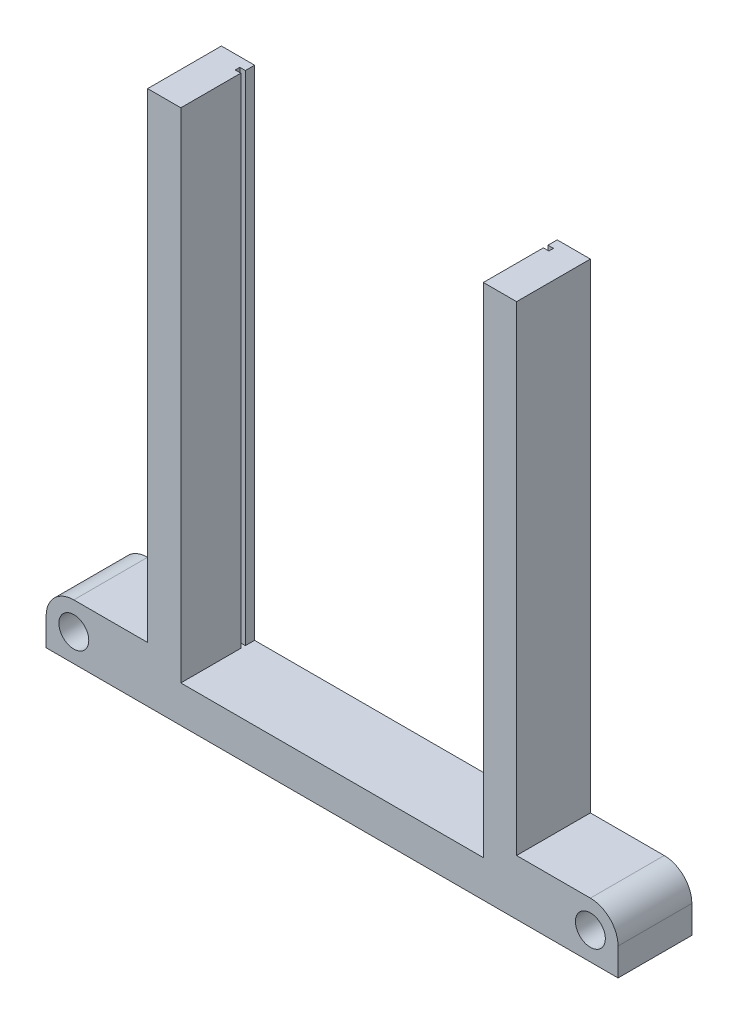
ISO-10303-21;
HEADER;
FILE_DESCRIPTION(('STEP AP214'),'2;1');
FILE_NAME('part.step','',(''),(''),'','','');
FILE_SCHEMA(('AUTOMOTIVE_DESIGN { 1 0 10303 214 1 1 1 1 }'));
ENDSEC;
DATA;
#1=APPLICATION_CONTEXT('core data for automotive mechanical design processes');
#2=APPLICATION_PROTOCOL_DEFINITION('international standard','automotive_design',2000,#1);
#3=PRODUCT_CONTEXT('',#1,'mechanical');
#4=PRODUCT('Part','Part','',(#3));
#5=PRODUCT_RELATED_PRODUCT_CATEGORY('part','',(#4));
#6=PRODUCT_DEFINITION_FORMATION('','',#4);
#7=PRODUCT_DEFINITION_CONTEXT('part definition',#1,'design');
#8=PRODUCT_DEFINITION('design','',#6,#7);
#9=PRODUCT_DEFINITION_SHAPE('','',#8);
#10=(LENGTH_UNIT() NAMED_UNIT(*) SI_UNIT(.MILLI.,.METRE.));
#11=(NAMED_UNIT(*) PLANE_ANGLE_UNIT() SI_UNIT($,.RADIAN.));
#12=(NAMED_UNIT(*) SI_UNIT($,.STERADIAN.) SOLID_ANGLE_UNIT());
#13=UNCERTAINTY_MEASURE_WITH_UNIT(LENGTH_MEASURE(1.E-05),#10,'distance_accuracy_value','');
#14=(GEOMETRIC_REPRESENTATION_CONTEXT(3) GLOBAL_UNCERTAINTY_ASSIGNED_CONTEXT((#13)) GLOBAL_UNIT_ASSIGNED_CONTEXT((#10,
#11,#12)) REPRESENTATION_CONTEXT('',''));
#15=CARTESIAN_POINT('',(0.,0.,0.));
#16=DIRECTION('',(0.,0.,1.));
#17=DIRECTION('',(1.,0.,0.));
#18=AXIS2_PLACEMENT_3D('',#15,#16,#17);
#19=CARTESIAN_POINT('',(-50.,145.,10.));
#20=DIRECTION('',(0.,-1.,0.));
#21=DIRECTION('',(0.,0.,-1.));
#22=AXIS2_PLACEMENT_3D('',#19,#20,#21);
#23=PLANE('',#22);
#24=DIRECTION('',(-1.,0.,0.));
#25=VECTOR('',#24,1.);
#26=CARTESIAN_POINT('',(-50.,145.,10.));
#27=LINE('',#26,#25);
#28=CARTESIAN_POINT('',(-41.,145.,10.));
#29=VERTEX_POINT('',#28);
#30=CARTESIAN_POINT('',(-50.,145.,10.));
#31=VERTEX_POINT('',#30);
#32=EDGE_CURVE('E144',#29,#31,#27,.T.);
#33=ORIENTED_EDGE('',*,*,#32,.F.);
#34=DIRECTION('',(0.,0.,1.));
#35=VECTOR('',#34,1.);
#36=CARTESIAN_POINT('',(-41.,145.,10.));
#37=LINE('',#36,#35);
#38=CARTESIAN_POINT('',(-41.,145.,-6.25));
#39=VERTEX_POINT('',#38);
#40=EDGE_CURVE('E311',#39,#29,#37,.T.);
#41=ORIENTED_EDGE('',*,*,#40,.F.);
#42=DIRECTION('',(1.,0.,0.));
#43=VECTOR('',#42,1.);
#44=CARTESIAN_POINT('',(-41.,145.,-6.25));
#45=LINE('',#44,#43);
#46=CARTESIAN_POINT('',(-42.5,145.,-6.25));
#47=VERTEX_POINT('',#46);
#48=EDGE_CURVE('E307',#47,#39,#45,.T.);
#49=ORIENTED_EDGE('',*,*,#48,.F.);
#50=DIRECTION('',(0.,0.,1.));
#51=VECTOR('',#50,1.);
#52=CARTESIAN_POINT('',(-42.5,145.,-6.25));
#53=LINE('',#52,#51);
#54=CARTESIAN_POINT('',(-42.5,145.,-7.5));
#55=VERTEX_POINT('',#54);
#56=EDGE_CURVE('E303',#55,#47,#53,.T.);
#57=ORIENTED_EDGE('',*,*,#56,.F.);
#58=DIRECTION('',(-1.,0.,0.));
#59=VECTOR('',#58,1.);
#60=CARTESIAN_POINT('',(-42.5,145.,-7.5));
#61=LINE('',#60,#59);
#62=CARTESIAN_POINT('',(-41.,145.,-7.5));
#63=VERTEX_POINT('',#62);
#64=EDGE_CURVE('E299',#63,#55,#61,.T.);
#65=ORIENTED_EDGE('',*,*,#64,.F.);
#66=DIRECTION('',(0.,0.,1.));
#67=VECTOR('',#66,1.);
#68=CARTESIAN_POINT('',(-41.,145.,-7.5));
#69=LINE('',#68,#67);
#70=CARTESIAN_POINT('',(-41.,145.,-10.));
#71=VERTEX_POINT('',#70);
#72=EDGE_CURVE('E295',#71,#63,#69,.T.);
#73=ORIENTED_EDGE('',*,*,#72,.F.);
#74=DIRECTION('',(-1.,0.,0.));
#75=VECTOR('',#74,1.);
#76=CARTESIAN_POINT('',(-50.,145.,-10.));
#77=LINE('',#76,#75);
#78=CARTESIAN_POINT('',(-50.,145.,-10.));
#79=VERTEX_POINT('',#78);
#80=EDGE_CURVE('E190',#71,#79,#77,.T.);
#81=ORIENTED_EDGE('',*,*,#80,.T.);
#82=DIRECTION('',(0.,0.,-1.));
#83=VECTOR('',#82,1.);
#84=CARTESIAN_POINT('',(-50.,145.,10.));
#85=LINE('',#84,#83);
#86=EDGE_CURVE('E159',#31,#79,#85,.T.);
#87=ORIENTED_EDGE('',*,*,#86,.F.);
#88=EDGE_LOOP('',(#33,#41,#49,#57,#65,#73,#81,#87));
#89=FACE_BOUND('',#88,.T.);
#90=ADVANCED_FACE('F41',(#89),#23,.F.);
#91=CARTESIAN_POINT('',(-70.,7.5,10.));
#92=DIRECTION('',(0.,0.,-1.));
#93=DIRECTION('',(-1.,0.,0.));
#94=AXIS2_PLACEMENT_3D('',#91,#92,#93);
#95=PLANE('',#94);
#96=DIRECTION('',(-1.,0.,0.));
#97=VECTOR('',#96,1.);
#98=CARTESIAN_POINT('',(41.,10.,10.));
#99=LINE('',#98,#97);
#100=CARTESIAN_POINT('',(41.,10.,10.));
#101=VERTEX_POINT('',#100);
#102=CARTESIAN_POINT('',(-41.,9.99999999999999,10.));
#103=VERTEX_POINT('',#102);
#104=EDGE_CURVE('E281',#101,#103,#99,.T.);
#105=ORIENTED_EDGE('',*,*,#104,.T.);
#106=DIRECTION('',(0.,1.,0.));
#107=VECTOR('',#106,1.);
#108=CARTESIAN_POINT('',(-41.,-87.3212459828649,10.));
#109=LINE('',#108,#107);
#110=EDGE_CURVE('E315',#103,#29,#109,.T.);
#111=ORIENTED_EDGE('',*,*,#110,.T.);
#112=ORIENTED_EDGE('',*,*,#32,.T.);
#113=DIRECTION('',(0.,-1.,0.));
#114=VECTOR('',#113,1.);
#115=CARTESIAN_POINT('',(-50.,15.,10.));
#116=LINE('',#115,#114);
#117=CARTESIAN_POINT('',(-50.,15.,10.));
#118=VERTEX_POINT('',#117);
#119=EDGE_CURVE('E134',#31,#118,#116,.T.);
#120=ORIENTED_EDGE('',*,*,#119,.T.);
#121=DIRECTION('',(-1.,0.,0.));
#122=VECTOR('',#121,1.);
#123=CARTESIAN_POINT('',(-70.,15.,10.));
#124=LINE('',#123,#122);
#125=CARTESIAN_POINT('',(-70.,15.,10.));
#126=VERTEX_POINT('',#125);
#127=EDGE_CURVE('E140',#118,#126,#124,.T.);
#128=ORIENTED_EDGE('',*,*,#127,.T.);
#129=CARTESIAN_POINT('',(-70.,7.5,10.));
#130=DIRECTION('',(0.,0.,1.));
#131=DIRECTION('',(-1.,0.,0.));
#132=AXIS2_PLACEMENT_3D('',#129,#130,#131);
#133=CIRCLE('',#132,7.5);
#134=CARTESIAN_POINT('',(-77.5,7.5,10.));
#135=VERTEX_POINT('',#134);
#136=EDGE_CURVE('E66',#126,#135,#133,.T.);
#137=ORIENTED_EDGE('',*,*,#136,.T.);
#138=DIRECTION('',(0.,-1.,0.));
#139=VECTOR('',#138,1.);
#140=CARTESIAN_POINT('',(-77.5,0.,10.));
#141=LINE('',#140,#139);
#142=CARTESIAN_POINT('',(-77.5,0.,10.));
#143=VERTEX_POINT('',#142);
#144=EDGE_CURVE('E202',#135,#143,#141,.T.);
#145=ORIENTED_EDGE('',*,*,#144,.T.);
#146=DIRECTION('',(1.,0.,0.));
#147=VECTOR('',#146,1.);
#148=CARTESIAN_POINT('',(-77.5,0.,10.));
#149=LINE('',#148,#147);
#150=CARTESIAN_POINT('',(77.5,0.,10.));
#151=VERTEX_POINT('',#150);
#152=EDGE_CURVE('E113',#143,#151,#149,.T.);
#153=ORIENTED_EDGE('',*,*,#152,.T.);
#154=DIRECTION('',(0.,1.,0.));
#155=VECTOR('',#154,1.);
#156=CARTESIAN_POINT('',(77.5,7.50000000000003,10.));
#157=LINE('',#156,#155);
#158=CARTESIAN_POINT('',(77.5,7.50000000000003,10.));
#159=VERTEX_POINT('',#158);
#160=EDGE_CURVE('E231',#151,#159,#157,.T.);
#161=ORIENTED_EDGE('',*,*,#160,.T.);
#162=CARTESIAN_POINT('',(70.,7.5,10.));
#163=DIRECTION('',(0.,0.,1.));
#164=DIRECTION('',(-1.,0.,0.));
#165=AXIS2_PLACEMENT_3D('',#162,#163,#164);
#166=CIRCLE('',#165,7.50000000000001);
#167=CARTESIAN_POINT('',(70.,15.,10.));
#168=VERTEX_POINT('',#167);
#169=EDGE_CURVE('E252',#159,#168,#166,.T.);
#170=ORIENTED_EDGE('',*,*,#169,.T.);
#171=DIRECTION('',(-1.,0.,0.));
#172=VECTOR('',#171,1.);
#173=CARTESIAN_POINT('',(50.,15.,10.));
#174=LINE('',#173,#172);
#175=CARTESIAN_POINT('',(50.,15.,10.));
#176=VERTEX_POINT('',#175);
#177=EDGE_CURVE('E248',#168,#176,#174,.T.);
#178=ORIENTED_EDGE('',*,*,#177,.T.);
#179=DIRECTION('',(0.,1.,0.));
#180=VECTOR('',#179,1.);
#181=CARTESIAN_POINT('',(50.,145.,10.));
#182=LINE('',#181,#180);
#183=CARTESIAN_POINT('',(50.,145.,10.));
#184=VERTEX_POINT('',#183);
#185=EDGE_CURVE('E251',#176,#184,#182,.T.);
#186=ORIENTED_EDGE('',*,*,#185,.T.);
#187=CARTESIAN_POINT('',(41.,145.,10.));
#188=VERTEX_POINT('',#187);
#189=EDGE_CURVE('E149',#184,#188,#27,.T.);
#190=ORIENTED_EDGE('',*,*,#189,.T.);
#191=DIRECTION('',(0.,1.,0.));
#192=VECTOR('',#191,1.);
#193=CARTESIAN_POINT('',(41.,-87.3212459828649,10.));
#194=LINE('',#193,#192);
#195=EDGE_CURVE('E57',#101,#188,#194,.T.);
#196=ORIENTED_EDGE('',*,*,#195,.F.);
#197=EDGE_LOOP('',(#105,#111,#112,#120,#128,#137,#145,#153,#161,#170,#178,#186,#190,#196));
#198=FACE_BOUND('',#197,.T.);
#199=CARTESIAN_POINT('',(-70.,7.5,10.));
#200=DIRECTION('',(0.,0.,1.));
#201=DIRECTION('',(1.,0.,0.));
#202=AXIS2_PLACEMENT_3D('',#199,#200,#201);
#203=CIRCLE('',#202,4.05);
#204=CARTESIAN_POINT('',(-65.95,7.5,10.));
#205=VERTEX_POINT('',#204);
#206=EDGE_CURVE('E175',#205,#205,#203,.T.);
#207=ORIENTED_EDGE('',*,*,#206,.F.);
#208=EDGE_LOOP('',(#207));
#209=FACE_BOUND('',#208,.T.);
#210=CARTESIAN_POINT('',(70.,7.5,10.));
#211=DIRECTION('',(0.,0.,1.));
#212=DIRECTION('',(1.,0.,0.));
#213=AXIS2_PLACEMENT_3D('',#210,#211,#212);
#214=CIRCLE('',#213,4.05);
#215=CARTESIAN_POINT('',(74.05,7.5,10.));
#216=VERTEX_POINT('',#215);
#217=EDGE_CURVE('E365',#216,#216,#214,.T.);
#218=ORIENTED_EDGE('',*,*,#217,.F.);
#219=EDGE_LOOP('',(#218));
#220=FACE_BOUND('',#219,.T.);
#221=ADVANCED_FACE('F137',(#198,#209,#220),#95,.F.);
#222=CARTESIAN_POINT('',(-70.,7.5,-10.));
#223=DIRECTION('',(0.,0.,-1.));
#224=DIRECTION('',(-1.,0.,0.));
#225=AXIS2_PLACEMENT_3D('',#222,#223,#224);
#226=PLANE('',#225);
#227=DIRECTION('',(0.,1.,0.));
#228=VECTOR('',#227,1.);
#229=CARTESIAN_POINT('',(-41.,-87.3212459828649,-10.));
#230=LINE('',#229,#228);
#231=CARTESIAN_POINT('',(-41.,9.99999999999999,-10.));
#232=VERTEX_POINT('',#231);
#233=EDGE_CURVE('E335',#232,#71,#230,.T.);
#234=ORIENTED_EDGE('',*,*,#233,.F.);
#235=DIRECTION('',(1.,0.,0.));
#236=VECTOR('',#235,1.);
#237=CARTESIAN_POINT('',(-41.,9.99999999999999,-10.));
#238=LINE('',#237,#236);
#239=CARTESIAN_POINT('',(41.,10.,-10.));
#240=VERTEX_POINT('',#239);
#241=EDGE_CURVE('E637',#232,#240,#238,.T.);
#242=ORIENTED_EDGE('',*,*,#241,.T.);
#243=DIRECTION('',(0.,1.,0.));
#244=VECTOR('',#243,1.);
#245=CARTESIAN_POINT('',(41.,-87.3212459828649,-10.));
#246=LINE('',#245,#244);
#247=CARTESIAN_POINT('',(41.,145.,-10.));
#248=VERTEX_POINT('',#247);
#249=EDGE_CURVE('E339',#240,#248,#246,.T.);
#250=ORIENTED_EDGE('',*,*,#249,.T.);
#251=CARTESIAN_POINT('',(50.,145.,-10.));
#252=VERTEX_POINT('',#251);
#253=EDGE_CURVE('E191',#252,#248,#77,.T.);
#254=ORIENTED_EDGE('',*,*,#253,.F.);
#255=DIRECTION('',(0.,1.,0.));
#256=VECTOR('',#255,1.);
#257=CARTESIAN_POINT('',(50.,145.,-10.));
#258=LINE('',#257,#256);
#259=CARTESIAN_POINT('',(50.,15.,-10.));
#260=VERTEX_POINT('',#259);
#261=EDGE_CURVE('E187',#260,#252,#258,.T.);
#262=ORIENTED_EDGE('',*,*,#261,.F.);
#263=DIRECTION('',(-1.,0.,0.));
#264=VECTOR('',#263,1.);
#265=CARTESIAN_POINT('',(50.,15.,-10.));
#266=LINE('',#265,#264);
#267=CARTESIAN_POINT('',(70.,15.,-10.));
#268=VERTEX_POINT('',#267);
#269=EDGE_CURVE('E184',#268,#260,#266,.T.);
#270=ORIENTED_EDGE('',*,*,#269,.F.);
#271=CARTESIAN_POINT('',(70.,7.5,-10.));
#272=DIRECTION('',(0.,0.,1.));
#273=DIRECTION('',(-1.,0.,0.));
#274=AXIS2_PLACEMENT_3D('',#271,#272,#273);
#275=CIRCLE('',#274,7.50000000000001);
#276=CARTESIAN_POINT('',(77.5,7.50000000000003,-10.));
#277=VERTEX_POINT('',#276);
#278=EDGE_CURVE('E181',#277,#268,#275,.T.);
#279=ORIENTED_EDGE('',*,*,#278,.F.);
#280=DIRECTION('',(0.,1.,0.));
#281=VECTOR('',#280,1.);
#282=CARTESIAN_POINT('',(77.5,7.50000000000003,-10.));
#283=LINE('',#282,#281);
#284=CARTESIAN_POINT('',(77.5,0.,-10.));
#285=VERTEX_POINT('',#284);
#286=EDGE_CURVE('E178',#285,#277,#283,.T.);
#287=ORIENTED_EDGE('',*,*,#286,.F.);
#288=DIRECTION('',(1.,0.,0.));
#289=VECTOR('',#288,1.);
#290=CARTESIAN_POINT('',(-77.5,0.,-10.));
#291=LINE('',#290,#289);
#292=CARTESIAN_POINT('',(-77.5,0.,-10.));
#293=VERTEX_POINT('',#292);
#294=EDGE_CURVE('E174',#293,#285,#291,.T.);
#295=ORIENTED_EDGE('',*,*,#294,.F.);
#296=DIRECTION('',(0.,-1.,0.));
#297=VECTOR('',#296,1.);
#298=CARTESIAN_POINT('',(-77.5,0.,-10.));
#299=LINE('',#298,#297);
#300=CARTESIAN_POINT('',(-77.5,7.5,-10.));
#301=VERTEX_POINT('',#300);
#302=EDGE_CURVE('E170',#301,#293,#299,.T.);
#303=ORIENTED_EDGE('',*,*,#302,.F.);
#304=CARTESIAN_POINT('',(-70.,7.5,-10.));
#305=DIRECTION('',(0.,0.,1.));
#306=DIRECTION('',(-1.,0.,0.));
#307=AXIS2_PLACEMENT_3D('',#304,#305,#306);
#308=CIRCLE('',#307,7.5);
#309=CARTESIAN_POINT('',(-70.,15.,-10.));
#310=VERTEX_POINT('',#309);
#311=EDGE_CURVE('E105',#310,#301,#308,.T.);
#312=ORIENTED_EDGE('',*,*,#311,.F.);
#313=DIRECTION('',(-1.,0.,0.));
#314=VECTOR('',#313,1.);
#315=CARTESIAN_POINT('',(-70.,15.,-10.));
#316=LINE('',#315,#314);
#317=CARTESIAN_POINT('',(-50.,15.,-10.));
#318=VERTEX_POINT('',#317);
#319=EDGE_CURVE('E197',#318,#310,#316,.T.);
#320=ORIENTED_EDGE('',*,*,#319,.F.);
#321=DIRECTION('',(0.,-1.,0.));
#322=VECTOR('',#321,1.);
#323=CARTESIAN_POINT('',(-50.,15.,-10.));
#324=LINE('',#323,#322);
#325=EDGE_CURVE('E155',#79,#318,#324,.T.);
#326=ORIENTED_EDGE('',*,*,#325,.F.);
#327=ORIENTED_EDGE('',*,*,#80,.F.);
#328=EDGE_LOOP('',(#234,#242,#250,#254,#262,#270,#279,#287,#295,#303,#312,#320,#326,#327));
#329=FACE_BOUND('',#328,.T.);
#330=CARTESIAN_POINT('',(-70.,7.5,-10.));
#331=DIRECTION('',(0.,0.,1.));
#332=DIRECTION('',(1.,0.,0.));
#333=AXIS2_PLACEMENT_3D('',#330,#331,#332);
#334=CIRCLE('',#333,4.05);
#335=CARTESIAN_POINT('',(-65.95,7.5,-10.));
#336=VERTEX_POINT('',#335);
#337=EDGE_CURVE('E369',#336,#336,#334,.T.);
#338=ORIENTED_EDGE('',*,*,#337,.T.);
#339=EDGE_LOOP('',(#338));
#340=FACE_BOUND('',#339,.T.);
#341=CARTESIAN_POINT('',(70.,7.5,-10.));
#342=DIRECTION('',(0.,0.,1.));
#343=DIRECTION('',(1.,0.,0.));
#344=AXIS2_PLACEMENT_3D('',#341,#342,#343);
#345=CIRCLE('',#344,4.05);
#346=CARTESIAN_POINT('',(74.05,7.5,-10.));
#347=VERTEX_POINT('',#346);
#348=EDGE_CURVE('E364',#347,#347,#345,.T.);
#349=ORIENTED_EDGE('',*,*,#348,.T.);
#350=EDGE_LOOP('',(#349));
#351=FACE_BOUND('',#350,.T.);
#352=ADVANCED_FACE('F235',(#329,#340,#351),#226,.T.);
#353=CARTESIAN_POINT('',(-77.5,0.,10.));
#354=DIRECTION('',(1.,0.,0.));
#355=DIRECTION('',(0.,1.,0.));
#356=AXIS2_PLACEMENT_3D('',#353,#354,#355);
#357=PLANE('',#356);
#358=ORIENTED_EDGE('',*,*,#302,.T.);
#359=DIRECTION('',(0.,0.,-1.));
#360=VECTOR('',#359,1.);
#361=CARTESIAN_POINT('',(-77.5,0.,10.));
#362=LINE('',#361,#360);
#363=EDGE_CURVE('E12',#143,#293,#362,.T.);
#364=ORIENTED_EDGE('',*,*,#363,.F.);
#365=ORIENTED_EDGE('',*,*,#144,.F.);
#366=DIRECTION('',(0.,0.,-1.));
#367=VECTOR('',#366,1.);
#368=CARTESIAN_POINT('',(-77.5,7.5,10.));
#369=LINE('',#368,#367);
#370=EDGE_CURVE('E166',#135,#301,#369,.T.);
#371=ORIENTED_EDGE('',*,*,#370,.T.);
#372=EDGE_LOOP('',(#358,#364,#365,#371));
#373=FACE_BOUND('',#372,.T.);
#374=ADVANCED_FACE('F43',(#373),#357,.F.);
#375=CARTESIAN_POINT('',(-77.5,0.,10.));
#376=DIRECTION('',(0.,1.,0.));
#377=DIRECTION('',(-1.,0.,0.));
#378=AXIS2_PLACEMENT_3D('',#375,#376,#377);
#379=PLANE('',#378);
#380=ORIENTED_EDGE('',*,*,#294,.T.);
#381=DIRECTION('',(0.,0.,-1.));
#382=VECTOR('',#381,1.);
#383=CARTESIAN_POINT('',(77.5,0.,10.));
#384=LINE('',#383,#382);
#385=EDGE_CURVE('E50',#151,#285,#384,.T.);
#386=ORIENTED_EDGE('',*,*,#385,.F.);
#387=ORIENTED_EDGE('',*,*,#152,.F.);
#388=ORIENTED_EDGE('',*,*,#363,.T.);
#389=EDGE_LOOP('',(#380,#386,#387,#388));
#390=FACE_BOUND('',#389,.T.);
#391=ADVANCED_FACE('F386',(#390),#379,.F.);
#392=CARTESIAN_POINT('',(77.5,7.50000000000003,10.));
#393=DIRECTION('',(-1.,0.,0.));
#394=DIRECTION('',(0.,-1.,0.));
#395=AXIS2_PLACEMENT_3D('',#392,#393,#394);
#396=PLANE('',#395);
#397=ORIENTED_EDGE('',*,*,#286,.T.);
#398=DIRECTION('',(0.,0.,-1.));
#399=VECTOR('',#398,1.);
#400=CARTESIAN_POINT('',(77.5,7.50000000000003,10.));
#401=LINE('',#400,#399);
#402=EDGE_CURVE('E221',#159,#277,#401,.T.);
#403=ORIENTED_EDGE('',*,*,#402,.F.);
#404=ORIENTED_EDGE('',*,*,#160,.F.);
#405=ORIENTED_EDGE('',*,*,#385,.T.);
#406=EDGE_LOOP('',(#397,#403,#404,#405));
#407=FACE_BOUND('',#406,.T.);
#408=ADVANCED_FACE('F229',(#407),#396,.F.);
#409=CARTESIAN_POINT('',(70.,7.5,10.));
#410=DIRECTION('',(0.,0.,-1.));
#411=DIRECTION('',(-1.,0.,0.));
#412=AXIS2_PLACEMENT_3D('',#409,#410,#411);
#413=CYLINDRICAL_SURFACE('',#412,7.50000000000001);
#414=ORIENTED_EDGE('',*,*,#278,.T.);
#415=DIRECTION('',(0.,0.,-1.));
#416=VECTOR('',#415,1.);
#417=CARTESIAN_POINT('',(70.,15.,10.));
#418=LINE('',#417,#416);
#419=EDGE_CURVE('E217',#168,#268,#418,.T.);
#420=ORIENTED_EDGE('',*,*,#419,.F.);
#421=ORIENTED_EDGE('',*,*,#169,.F.);
#422=ORIENTED_EDGE('',*,*,#402,.T.);
#423=EDGE_LOOP('',(#414,#420,#421,#422));
#424=FACE_BOUND('',#423,.T.);
#425=ADVANCED_FACE('F242',(#424),#413,.T.);
#426=CARTESIAN_POINT('',(50.,15.,10.));
#427=DIRECTION('',(0.,-1.,0.));
#428=DIRECTION('',(1.,0.,0.));
#429=AXIS2_PLACEMENT_3D('',#426,#427,#428);
#430=PLANE('',#429);
#431=ORIENTED_EDGE('',*,*,#269,.T.);
#432=DIRECTION('',(0.,0.,-1.));
#433=VECTOR('',#432,1.);
#434=CARTESIAN_POINT('',(50.,15.,10.));
#435=LINE('',#434,#433);
#436=EDGE_CURVE('E213',#176,#260,#435,.T.);
#437=ORIENTED_EDGE('',*,*,#436,.F.);
#438=ORIENTED_EDGE('',*,*,#177,.F.);
#439=ORIENTED_EDGE('',*,*,#419,.T.);
#440=EDGE_LOOP('',(#431,#437,#438,#439));
#441=FACE_BOUND('',#440,.T.);
#442=ADVANCED_FACE('F246',(#441),#430,.F.);
#443=CARTESIAN_POINT('',(50.,145.,10.));
#444=DIRECTION('',(-1.,0.,0.));
#445=DIRECTION('',(0.,0.,1.));
#446=AXIS2_PLACEMENT_3D('',#443,#444,#445);
#447=PLANE('',#446);
#448=ORIENTED_EDGE('',*,*,#261,.T.);
#449=DIRECTION('',(0.,0.,-1.));
#450=VECTOR('',#449,1.);
#451=CARTESIAN_POINT('',(50.,145.,10.));
#452=LINE('',#451,#450);
#453=EDGE_CURVE('E209',#184,#252,#452,.T.);
#454=ORIENTED_EDGE('',*,*,#453,.F.);
#455=ORIENTED_EDGE('',*,*,#185,.F.);
#456=ORIENTED_EDGE('',*,*,#436,.T.);
#457=EDGE_LOOP('',(#448,#454,#455,#456));
#458=FACE_BOUND('',#457,.T.);
#459=ADVANCED_FACE('F403',(#458),#447,.F.);
#460=ORIENTED_EDGE('',*,*,#253,.T.);
#461=DIRECTION('',(0.,0.,-1.));
#462=VECTOR('',#461,1.);
#463=CARTESIAN_POINT('',(41.,145.,-10.));
#464=LINE('',#463,#462);
#465=CARTESIAN_POINT('',(41.,145.,-7.5));
#466=VERTEX_POINT('',#465);
#467=EDGE_CURVE('E291',#466,#248,#464,.T.);
#468=ORIENTED_EDGE('',*,*,#467,.F.);
#469=DIRECTION('',(-1.,0.,0.));
#470=VECTOR('',#469,1.);
#471=CARTESIAN_POINT('',(41.,145.,-7.5));
#472=LINE('',#471,#470);
#473=CARTESIAN_POINT('',(42.5,145.,-7.5));
#474=VERTEX_POINT('',#473);
#475=EDGE_CURVE('E287',#474,#466,#472,.T.);
#476=ORIENTED_EDGE('',*,*,#475,.F.);
#477=DIRECTION('',(0.,0.,-1.));
#478=VECTOR('',#477,1.);
#479=CARTESIAN_POINT('',(42.5,145.,-7.5));
#480=LINE('',#479,#478);
#481=CARTESIAN_POINT('',(42.5,145.,-6.25));
#482=VERTEX_POINT('',#481);
#483=EDGE_CURVE('E278',#482,#474,#480,.T.);
#484=ORIENTED_EDGE('',*,*,#483,.F.);
#485=DIRECTION('',(1.,0.,0.));
#486=VECTOR('',#485,1.);
#487=CARTESIAN_POINT('',(42.5,145.,-6.25));
#488=LINE('',#487,#486);
#489=CARTESIAN_POINT('',(41.,145.,-6.25));
#490=VERTEX_POINT('',#489);
#491=EDGE_CURVE('E273',#490,#482,#488,.T.);
#492=ORIENTED_EDGE('',*,*,#491,.F.);
#493=DIRECTION('',(0.,0.,-1.));
#494=VECTOR('',#493,1.);
#495=CARTESIAN_POINT('',(41.,145.,-6.25));
#496=LINE('',#495,#494);
#497=EDGE_CURVE('E269',#188,#490,#496,.T.);
#498=ORIENTED_EDGE('',*,*,#497,.F.);
#499=ORIENTED_EDGE('',*,*,#189,.F.);
#500=ORIENTED_EDGE('',*,*,#453,.T.);
#501=EDGE_LOOP('',(#460,#468,#476,#484,#492,#498,#499,#500));
#502=FACE_BOUND('',#501,.T.);
#503=ADVANCED_FACE('F266',(#502),#23,.F.);
#504=CARTESIAN_POINT('',(-50.,15.,10.));
#505=DIRECTION('',(1.,0.,0.));
#506=DIRECTION('',(0.,0.,-1.));
#507=AXIS2_PLACEMENT_3D('',#504,#505,#506);
#508=PLANE('',#507);
#509=ORIENTED_EDGE('',*,*,#325,.T.);
#510=DIRECTION('',(0.,0.,-1.));
#511=VECTOR('',#510,1.);
#512=CARTESIAN_POINT('',(-50.,15.,10.));
#513=LINE('',#512,#511);
#514=EDGE_CURVE('E152',#118,#318,#513,.T.);
#515=ORIENTED_EDGE('',*,*,#514,.F.);
#516=ORIENTED_EDGE('',*,*,#119,.F.);
#517=ORIENTED_EDGE('',*,*,#86,.T.);
#518=EDGE_LOOP('',(#509,#515,#516,#517));
#519=FACE_BOUND('',#518,.T.);
#520=ADVANCED_FACE('F153',(#519),#508,.F.);
#521=CARTESIAN_POINT('',(-70.,15.,10.));
#522=DIRECTION('',(0.,-1.,0.));
#523=DIRECTION('',(0.,0.,-1.));
#524=AXIS2_PLACEMENT_3D('',#521,#522,#523);
#525=PLANE('',#524);
#526=ORIENTED_EDGE('',*,*,#319,.T.);
#527=DIRECTION('',(0.,0.,-1.));
#528=VECTOR('',#527,1.);
#529=CARTESIAN_POINT('',(-70.,15.,10.));
#530=LINE('',#529,#528);
#531=EDGE_CURVE('E160',#126,#310,#530,.T.);
#532=ORIENTED_EDGE('',*,*,#531,.F.);
#533=ORIENTED_EDGE('',*,*,#127,.F.);
#534=ORIENTED_EDGE('',*,*,#514,.T.);
#535=EDGE_LOOP('',(#526,#532,#533,#534));
#536=FACE_BOUND('',#535,.T.);
#537=ADVANCED_FACE('F162',(#536),#525,.F.);
#538=CARTESIAN_POINT('',(-70.,7.5,10.));
#539=DIRECTION('',(0.,0.,-1.));
#540=DIRECTION('',(-1.,0.,0.));
#541=AXIS2_PLACEMENT_3D('',#538,#539,#540);
#542=CYLINDRICAL_SURFACE('',#541,7.5);
#543=ORIENTED_EDGE('',*,*,#311,.T.);
#544=ORIENTED_EDGE('',*,*,#370,.F.);
#545=ORIENTED_EDGE('',*,*,#136,.F.);
#546=ORIENTED_EDGE('',*,*,#531,.T.);
#547=EDGE_LOOP('',(#543,#544,#545,#546));
#548=FACE_BOUND('',#547,.T.);
#549=ADVANCED_FACE('F443',(#548),#542,.T.);
#550=CARTESIAN_POINT('',(-70.,7.5,10.));
#551=DIRECTION('',(0.,0.,-1.));
#552=DIRECTION('',(-1.,0.,0.));
#553=AXIS2_PLACEMENT_3D('',#550,#551,#552);
#554=CYLINDRICAL_SURFACE('',#553,4.05);
#555=ORIENTED_EDGE('',*,*,#206,.T.);
#556=EDGE_LOOP('',(#555));
#557=FACE_BOUND('',#556,.T.);
#558=ORIENTED_EDGE('',*,*,#337,.F.);
#559=EDGE_LOOP('',(#558));
#560=FACE_BOUND('',#559,.T.);
#561=ADVANCED_FACE('F452',(#557,#560),#554,.F.);
#562=CARTESIAN_POINT('',(70.,7.5,10.));
#563=DIRECTION('',(0.,0.,-1.));
#564=DIRECTION('',(-1.,0.,0.));
#565=AXIS2_PLACEMENT_3D('',#562,#563,#564);
#566=CYLINDRICAL_SURFACE('',#565,4.05);
#567=ORIENTED_EDGE('',*,*,#217,.T.);
#568=EDGE_LOOP('',(#567));
#569=FACE_BOUND('',#568,.T.);
#570=ORIENTED_EDGE('',*,*,#348,.F.);
#571=EDGE_LOOP('',(#570));
#572=FACE_BOUND('',#571,.T.);
#573=ADVANCED_FACE('F461',(#569,#572),#566,.F.);
#574=CARTESIAN_POINT('',(-41.,-87.3212459828649,10.));
#575=DIRECTION('',(-1.,0.,0.));
#576=DIRECTION('',(0.,0.,1.));
#577=AXIS2_PLACEMENT_3D('',#574,#575,#576);
#578=PLANE('',#577);
#579=DIRECTION('',(0.,0.,-1.));
#580=VECTOR('',#579,1.);
#581=CARTESIAN_POINT('',(-41.,9.99999999999999,10.));
#582=LINE('',#581,#580);
#583=CARTESIAN_POINT('',(-41.,9.99999999999999,-6.25));
#584=VERTEX_POINT('',#583);
#585=EDGE_CURVE('E614',#103,#584,#582,.T.);
#586=ORIENTED_EDGE('',*,*,#585,.T.);
#587=DIRECTION('',(0.,1.,0.));
#588=VECTOR('',#587,1.);
#589=CARTESIAN_POINT('',(-41.,-87.3212459828649,-6.25));
#590=LINE('',#589,#588);
#591=EDGE_CURVE('E319',#584,#39,#590,.T.);
#592=ORIENTED_EDGE('',*,*,#591,.T.);
#593=ORIENTED_EDGE('',*,*,#40,.T.);
#594=ORIENTED_EDGE('',*,*,#110,.F.);
#595=EDGE_LOOP('',(#586,#592,#593,#594));
#596=FACE_BOUND('',#595,.T.);
#597=ADVANCED_FACE('F470',(#596),#578,.F.);
#598=CARTESIAN_POINT('',(-41.,-87.3212459828649,-6.25));
#599=DIRECTION('',(0.,0.,1.));
#600=DIRECTION('',(1.,0.,0.));
#601=AXIS2_PLACEMENT_3D('',#598,#599,#600);
#602=PLANE('',#601);
#603=DIRECTION('',(-1.,0.,0.));
#604=VECTOR('',#603,1.);
#605=CARTESIAN_POINT('',(-41.,9.99999999999999,-6.25));
#606=LINE('',#605,#604);
#607=CARTESIAN_POINT('',(-42.5,9.99999999999999,-6.25));
#608=VERTEX_POINT('',#607);
#609=EDGE_CURVE('E619',#584,#608,#606,.T.);
#610=ORIENTED_EDGE('',*,*,#609,.T.);
#611=DIRECTION('',(0.,1.,0.));
#612=VECTOR('',#611,1.);
#613=CARTESIAN_POINT('',(-42.5,-87.3212459828649,-6.25));
#614=LINE('',#613,#612);
#615=EDGE_CURVE('E323',#608,#47,#614,.T.);
#616=ORIENTED_EDGE('',*,*,#615,.T.);
#617=ORIENTED_EDGE('',*,*,#48,.T.);
#618=ORIENTED_EDGE('',*,*,#591,.F.);
#619=EDGE_LOOP('',(#610,#616,#617,#618));
#620=FACE_BOUND('',#619,.T.);
#621=ADVANCED_FACE('F503',(#620),#602,.F.);
#622=CARTESIAN_POINT('',(-42.5,-87.3212459828649,-6.25));
#623=DIRECTION('',(-1.,0.,0.));
#624=DIRECTION('',(0.,0.,1.));
#625=AXIS2_PLACEMENT_3D('',#622,#623,#624);
#626=PLANE('',#625);
#627=DIRECTION('',(0.,0.,-1.));
#628=VECTOR('',#627,1.);
#629=CARTESIAN_POINT('',(-42.5,9.99999999999999,-6.25));
#630=LINE('',#629,#628);
#631=CARTESIAN_POINT('',(-42.5,9.99999999999999,-7.5));
#632=VERTEX_POINT('',#631);
#633=EDGE_CURVE('E623',#608,#632,#630,.T.);
#634=ORIENTED_EDGE('',*,*,#633,.T.);
#635=DIRECTION('',(0.,1.,0.));
#636=VECTOR('',#635,1.);
#637=CARTESIAN_POINT('',(-42.5,-87.3212459828649,-7.5));
#638=LINE('',#637,#636);
#639=EDGE_CURVE('E327',#632,#55,#638,.T.);
#640=ORIENTED_EDGE('',*,*,#639,.T.);
#641=ORIENTED_EDGE('',*,*,#56,.T.);
#642=ORIENTED_EDGE('',*,*,#615,.F.);
#643=EDGE_LOOP('',(#634,#640,#641,#642));
#644=FACE_BOUND('',#643,.T.);
#645=ADVANCED_FACE('F513',(#644),#626,.F.);
#646=CARTESIAN_POINT('',(-42.5,-87.3212459828649,-7.5));
#647=DIRECTION('',(0.,0.,-1.));
#648=DIRECTION('',(-1.,0.,0.));
#649=AXIS2_PLACEMENT_3D('',#646,#647,#648);
#650=PLANE('',#649);
#651=DIRECTION('',(1.,0.,0.));
#652=VECTOR('',#651,1.);
#653=CARTESIAN_POINT('',(-42.5,9.99999999999999,-7.5));
#654=LINE('',#653,#652);
#655=CARTESIAN_POINT('',(-41.,9.99999999999999,-7.5));
#656=VERTEX_POINT('',#655);
#657=EDGE_CURVE('E629',#632,#656,#654,.T.);
#658=ORIENTED_EDGE('',*,*,#657,.T.);
#659=DIRECTION('',(0.,1.,0.));
#660=VECTOR('',#659,1.);
#661=CARTESIAN_POINT('',(-41.,-87.3212459828649,-7.5));
#662=LINE('',#661,#660);
#663=EDGE_CURVE('E331',#656,#63,#662,.T.);
#664=ORIENTED_EDGE('',*,*,#663,.T.);
#665=ORIENTED_EDGE('',*,*,#64,.T.);
#666=ORIENTED_EDGE('',*,*,#639,.F.);
#667=EDGE_LOOP('',(#658,#664,#665,#666));
#668=FACE_BOUND('',#667,.T.);
#669=ADVANCED_FACE('F523',(#668),#650,.F.);
#670=CARTESIAN_POINT('',(-41.,-87.3212459828649,-7.5));
#671=DIRECTION('',(-1.,0.,0.));
#672=DIRECTION('',(0.,0.,1.));
#673=AXIS2_PLACEMENT_3D('',#670,#671,#672);
#674=PLANE('',#673);
#675=DIRECTION('',(0.,0.,-1.));
#676=VECTOR('',#675,1.);
#677=CARTESIAN_POINT('',(-41.,9.99999999999999,-7.5));
#678=LINE('',#677,#676);
#679=EDGE_CURVE('E633',#656,#232,#678,.T.);
#680=ORIENTED_EDGE('',*,*,#679,.T.);
#681=ORIENTED_EDGE('',*,*,#233,.T.);
#682=ORIENTED_EDGE('',*,*,#72,.T.);
#683=ORIENTED_EDGE('',*,*,#663,.F.);
#684=EDGE_LOOP('',(#680,#681,#682,#683));
#685=FACE_BOUND('',#684,.T.);
#686=ADVANCED_FACE('F533',(#685),#674,.F.);
#687=CARTESIAN_POINT('',(41.,-87.3212459828649,-10.));
#688=DIRECTION('',(1.,0.,0.));
#689=DIRECTION('',(0.,0.,-1.));
#690=AXIS2_PLACEMENT_3D('',#687,#688,#689);
#691=PLANE('',#690);
#692=DIRECTION('',(0.,0.,1.));
#693=VECTOR('',#692,1.);
#694=CARTESIAN_POINT('',(41.,10.,-10.));
#695=LINE('',#694,#693);
#696=CARTESIAN_POINT('',(41.,10.,-7.5));
#697=VERTEX_POINT('',#696);
#698=EDGE_CURVE('E641',#240,#697,#695,.T.);
#699=ORIENTED_EDGE('',*,*,#698,.T.);
#700=DIRECTION('',(0.,1.,0.));
#701=VECTOR('',#700,1.);
#702=CARTESIAN_POINT('',(41.,-87.3212459828649,-7.5));
#703=LINE('',#702,#701);
#704=EDGE_CURVE('E343',#697,#466,#703,.T.);
#705=ORIENTED_EDGE('',*,*,#704,.T.);
#706=ORIENTED_EDGE('',*,*,#467,.T.);
#707=ORIENTED_EDGE('',*,*,#249,.F.);
#708=EDGE_LOOP('',(#699,#705,#706,#707));
#709=FACE_BOUND('',#708,.T.);
#710=ADVANCED_FACE('F543',(#709),#691,.F.);
#711=CARTESIAN_POINT('',(41.,-87.3212459828649,-7.5));
#712=DIRECTION('',(0.,0.,-1.));
#713=DIRECTION('',(-1.,0.,0.));
#714=AXIS2_PLACEMENT_3D('',#711,#712,#713);
#715=PLANE('',#714);
#716=DIRECTION('',(1.,0.,0.));
#717=VECTOR('',#716,1.);
#718=CARTESIAN_POINT('',(41.,10.,-7.5));
#719=LINE('',#718,#717);
#720=CARTESIAN_POINT('',(42.5,10.,-7.5));
#721=VERTEX_POINT('',#720);
#722=EDGE_CURVE('E645',#697,#721,#719,.T.);
#723=ORIENTED_EDGE('',*,*,#722,.T.);
#724=DIRECTION('',(0.,1.,0.));
#725=VECTOR('',#724,1.);
#726=CARTESIAN_POINT('',(42.5,-87.3212459828649,-7.5));
#727=LINE('',#726,#725);
#728=EDGE_CURVE('E347',#721,#474,#727,.T.);
#729=ORIENTED_EDGE('',*,*,#728,.T.);
#730=ORIENTED_EDGE('',*,*,#475,.T.);
#731=ORIENTED_EDGE('',*,*,#704,.F.);
#732=EDGE_LOOP('',(#723,#729,#730,#731));
#733=FACE_BOUND('',#732,.T.);
#734=ADVANCED_FACE('F553',(#733),#715,.F.);
#735=CARTESIAN_POINT('',(42.5,-87.3212459828649,-7.5));
#736=DIRECTION('',(1.,0.,0.));
#737=DIRECTION('',(0.,0.,-1.));
#738=AXIS2_PLACEMENT_3D('',#735,#736,#737);
#739=PLANE('',#738);
#740=DIRECTION('',(0.,0.,1.));
#741=VECTOR('',#740,1.);
#742=CARTESIAN_POINT('',(42.5,10.,-7.5));
#743=LINE('',#742,#741);
#744=CARTESIAN_POINT('',(42.5,10.,-6.25));
#745=VERTEX_POINT('',#744);
#746=EDGE_CURVE('E649',#721,#745,#743,.T.);
#747=ORIENTED_EDGE('',*,*,#746,.T.);
#748=DIRECTION('',(0.,1.,0.));
#749=VECTOR('',#748,1.);
#750=CARTESIAN_POINT('',(42.5,-87.3212459828649,-6.25));
#751=LINE('',#750,#749);
#752=EDGE_CURVE('E351',#745,#482,#751,.T.);
#753=ORIENTED_EDGE('',*,*,#752,.T.);
#754=ORIENTED_EDGE('',*,*,#483,.T.);
#755=ORIENTED_EDGE('',*,*,#728,.F.);
#756=EDGE_LOOP('',(#747,#753,#754,#755));
#757=FACE_BOUND('',#756,.T.);
#758=ADVANCED_FACE('F563',(#757),#739,.F.);
#759=CARTESIAN_POINT('',(42.5,-87.3212459828649,-6.25));
#760=DIRECTION('',(0.,0.,1.));
#761=DIRECTION('',(1.,0.,0.));
#762=AXIS2_PLACEMENT_3D('',#759,#760,#761);
#763=PLANE('',#762);
#764=DIRECTION('',(-1.,0.,0.));
#765=VECTOR('',#764,1.);
#766=CARTESIAN_POINT('',(42.5,10.,-6.25));
#767=LINE('',#766,#765);
#768=CARTESIAN_POINT('',(41.,10.,-6.25));
#769=VERTEX_POINT('',#768);
#770=EDGE_CURVE('E318',#745,#769,#767,.T.);
#771=ORIENTED_EDGE('',*,*,#770,.T.);
#772=DIRECTION('',(0.,1.,0.));
#773=VECTOR('',#772,1.);
#774=CARTESIAN_POINT('',(41.,-87.3212459828649,-6.25));
#775=LINE('',#774,#773);
#776=EDGE_CURVE('E355',#769,#490,#775,.T.);
#777=ORIENTED_EDGE('',*,*,#776,.T.);
#778=ORIENTED_EDGE('',*,*,#491,.T.);
#779=ORIENTED_EDGE('',*,*,#752,.F.);
#780=EDGE_LOOP('',(#771,#777,#778,#779));
#781=FACE_BOUND('',#780,.T.);
#782=ADVANCED_FACE('F573',(#781),#763,.F.);
#783=CARTESIAN_POINT('',(41.,-87.3212459828649,-6.25));
#784=DIRECTION('',(1.,0.,0.));
#785=DIRECTION('',(0.,0.,-1.));
#786=AXIS2_PLACEMENT_3D('',#783,#784,#785);
#787=PLANE('',#786);
#788=DIRECTION('',(0.,0.,1.));
#789=VECTOR('',#788,1.);
#790=CARTESIAN_POINT('',(41.,10.,-6.25));
#791=LINE('',#790,#789);
#792=EDGE_CURVE('E361',#769,#101,#791,.T.);
#793=ORIENTED_EDGE('',*,*,#792,.T.);
#794=ORIENTED_EDGE('',*,*,#195,.T.);
#795=ORIENTED_EDGE('',*,*,#497,.T.);
#796=ORIENTED_EDGE('',*,*,#776,.F.);
#797=EDGE_LOOP('',(#793,#794,#795,#796));
#798=FACE_BOUND('',#797,.T.);
#799=ADVANCED_FACE('F583',(#798),#787,.F.);
#800=CARTESIAN_POINT('',(-77.5,10.,10.));
#801=DIRECTION('',(0.,1.,0.));
#802=DIRECTION('',(-1.,0.,0.));
#803=AXIS2_PLACEMENT_3D('',#800,#801,#802);
#804=PLANE('',#803);
#805=ORIENTED_EDGE('',*,*,#104,.F.);
#806=ORIENTED_EDGE('',*,*,#792,.F.);
#807=ORIENTED_EDGE('',*,*,#770,.F.);
#808=ORIENTED_EDGE('',*,*,#746,.F.);
#809=ORIENTED_EDGE('',*,*,#722,.F.);
#810=ORIENTED_EDGE('',*,*,#698,.F.);
#811=ORIENTED_EDGE('',*,*,#241,.F.);
#812=ORIENTED_EDGE('',*,*,#679,.F.);
#813=ORIENTED_EDGE('',*,*,#657,.F.);
#814=ORIENTED_EDGE('',*,*,#633,.F.);
#815=ORIENTED_EDGE('',*,*,#609,.F.);
#816=ORIENTED_EDGE('',*,*,#585,.F.);
#817=EDGE_LOOP('',(#805,#806,#807,#808,#809,#810,#811,#812,#813,#814,#815,#816));
#818=FACE_BOUND('',#817,.T.);
#819=ADVANCED_FACE('F593',(#818),#804,.T.);
#820=CLOSED_SHELL('',(#90,#221,#352,#374,#391,#408,#425,#442,#459,#503,#520,#537,#549,#561,#573,
#597,#621,#645,#669,#686,#710,#734,#758,#782,#799,#819));
#821=MANIFOLD_SOLID_BREP('B2',#820);
#822=ADVANCED_BREP_SHAPE_REPRESENTATION('',(#18,#821),#14);
#823=SHAPE_DEFINITION_REPRESENTATION(#9,#822);
ENDSEC;
END-ISO-10303-21;
